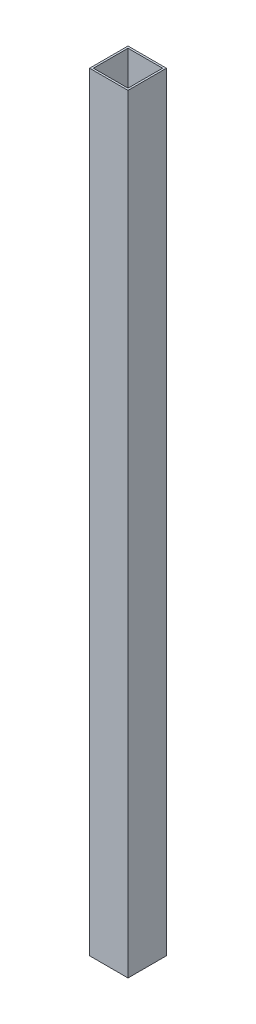
ISO-10303-21;
HEADER;
FILE_DESCRIPTION(('STEP AP214'),'2;1');
FILE_NAME('part.step','',(''),(''),'','','');
FILE_SCHEMA(('AUTOMOTIVE_DESIGN { 1 0 10303 214 1 1 1 1 }'));
ENDSEC;
DATA;
#1=APPLICATION_CONTEXT('core data for automotive mechanical design processes');
#2=APPLICATION_PROTOCOL_DEFINITION('international standard','automotive_design',2000,#1);
#3=PRODUCT_CONTEXT('',#1,'mechanical');
#4=PRODUCT('Part','Part','',(#3));
#5=PRODUCT_RELATED_PRODUCT_CATEGORY('part','',(#4));
#6=PRODUCT_DEFINITION_FORMATION('','',#4);
#7=PRODUCT_DEFINITION_CONTEXT('part definition',#1,'design');
#8=PRODUCT_DEFINITION('design','',#6,#7);
#9=PRODUCT_DEFINITION_SHAPE('','',#8);
#10=(LENGTH_UNIT() NAMED_UNIT(*) SI_UNIT(.MILLI.,.METRE.));
#11=(NAMED_UNIT(*) PLANE_ANGLE_UNIT() SI_UNIT($,.RADIAN.));
#12=(NAMED_UNIT(*) SI_UNIT($,.STERADIAN.) SOLID_ANGLE_UNIT());
#13=UNCERTAINTY_MEASURE_WITH_UNIT(LENGTH_MEASURE(1.E-05),#10,'distance_accuracy_value','');
#14=(GEOMETRIC_REPRESENTATION_CONTEXT(3) GLOBAL_UNCERTAINTY_ASSIGNED_CONTEXT((#13)) GLOBAL_UNIT_ASSIGNED_CONTEXT((#10,
#11,#12)) REPRESENTATION_CONTEXT('',''));
#15=CARTESIAN_POINT('',(0.,0.,0.));
#16=DIRECTION('',(0.,0.,1.));
#17=DIRECTION('',(1.,0.,0.));
#18=AXIS2_PLACEMENT_3D('',#15,#16,#17);
#19=CARTESIAN_POINT('',(0.,508.,0.));
#20=DIRECTION('',(0.,-1.,0.));
#21=DIRECTION('',(0.,0.,-1.));
#22=AXIS2_PLACEMENT_3D('',#19,#20,#21);
#23=PLANE('',#22);
#24=DIRECTION('',(1.,0.,0.));
#25=VECTOR('',#24,1.);
#26=CARTESIAN_POINT('',(25.4,508.,0.));
#27=LINE('',#26,#25);
#28=CARTESIAN_POINT('',(0.,508.,0.));
#29=VERTEX_POINT('',#28);
#30=CARTESIAN_POINT('',(25.4,508.,0.));
#31=VERTEX_POINT('',#30);
#32=EDGE_CURVE('E134',#29,#31,#27,.T.);
#33=ORIENTED_EDGE('',*,*,#32,.T.);
#34=DIRECTION('',(0.,0.,-1.));
#35=VECTOR('',#34,1.);
#36=CARTESIAN_POINT('',(25.4,508.,-25.4));
#37=LINE('',#36,#35);
#38=CARTESIAN_POINT('',(25.4,508.,-25.4));
#39=VERTEX_POINT('',#38);
#40=EDGE_CURVE('E137',#31,#39,#37,.T.);
#41=ORIENTED_EDGE('',*,*,#40,.T.);
#42=DIRECTION('',(-1.,0.,0.));
#43=VECTOR('',#42,1.);
#44=CARTESIAN_POINT('',(0.,508.,-25.4));
#45=LINE('',#44,#43);
#46=CARTESIAN_POINT('',(0.,508.,-25.4));
#47=VERTEX_POINT('',#46);
#48=EDGE_CURVE('E140',#39,#47,#45,.T.);
#49=ORIENTED_EDGE('',*,*,#48,.T.);
#50=DIRECTION('',(0.,0.,1.));
#51=VECTOR('',#50,1.);
#52=CARTESIAN_POINT('',(0.,508.,0.));
#53=LINE('',#52,#51);
#54=EDGE_CURVE('E142',#47,#29,#53,.T.);
#55=ORIENTED_EDGE('',*,*,#54,.T.);
#56=EDGE_LOOP('',(#33,#41,#49,#55));
#57=FACE_BOUND('',#56,.T.);
#58=DIRECTION('',(1.,0.,0.));
#59=VECTOR('',#58,1.);
#60=CARTESIAN_POINT('',(1.27,508.,-1.27));
#61=LINE('',#60,#59);
#62=CARTESIAN_POINT('',(1.27,508.,-1.27));
#63=VERTEX_POINT('',#62);
#64=CARTESIAN_POINT('',(24.13,508.,-1.27));
#65=VERTEX_POINT('',#64);
#66=EDGE_CURVE('E101',#63,#65,#61,.T.);
#67=ORIENTED_EDGE('',*,*,#66,.F.);
#68=DIRECTION('',(0.,0.,1.));
#69=VECTOR('',#68,1.);
#70=CARTESIAN_POINT('',(1.27,508.,-12.3614591557052));
#71=LINE('',#70,#69);
#72=CARTESIAN_POINT('',(1.27,508.,-24.13));
#73=VERTEX_POINT('',#72);
#74=EDGE_CURVE('E96',#73,#63,#71,.T.);
#75=ORIENTED_EDGE('',*,*,#74,.F.);
#76=DIRECTION('',(-1.,0.,0.));
#77=VECTOR('',#76,1.);
#78=CARTESIAN_POINT('',(12.7,508.,-24.13));
#79=LINE('',#78,#77);
#80=CARTESIAN_POINT('',(24.13,508.,-24.13));
#81=VERTEX_POINT('',#80);
#82=EDGE_CURVE('E117',#81,#73,#79,.T.);
#83=ORIENTED_EDGE('',*,*,#82,.F.);
#84=DIRECTION('',(0.,0.,-1.));
#85=VECTOR('',#84,1.);
#86=CARTESIAN_POINT('',(24.13,508.,-1.27));
#87=LINE('',#86,#85);
#88=EDGE_CURVE('E115',#65,#81,#87,.T.);
#89=ORIENTED_EDGE('',*,*,#88,.F.);
#90=EDGE_LOOP('',(#67,#75,#83,#89));
#91=FACE_BOUND('',#90,.T.);
#92=ADVANCED_FACE('F34',(#57,#91),#23,.F.);
#93=CARTESIAN_POINT('',(0.,0.,0.));
#94=DIRECTION('',(0.,-1.,0.));
#95=DIRECTION('',(0.,0.,-1.));
#96=AXIS2_PLACEMENT_3D('',#93,#94,#95);
#97=PLANE('',#96);
#98=DIRECTION('',(1.,0.,0.));
#99=VECTOR('',#98,1.);
#100=CARTESIAN_POINT('',(25.4,0.,0.));
#101=LINE('',#100,#99);
#102=CARTESIAN_POINT('',(0.,0.,0.));
#103=VERTEX_POINT('',#102);
#104=CARTESIAN_POINT('',(25.4,0.,0.));
#105=VERTEX_POINT('',#104);
#106=EDGE_CURVE('E111',#103,#105,#101,.T.);
#107=ORIENTED_EDGE('',*,*,#106,.F.);
#108=DIRECTION('',(0.,0.,1.));
#109=VECTOR('',#108,1.);
#110=CARTESIAN_POINT('',(0.,0.,0.));
#111=LINE('',#110,#109);
#112=CARTESIAN_POINT('',(0.,0.,-25.4));
#113=VERTEX_POINT('',#112);
#114=EDGE_CURVE('E138',#113,#103,#111,.T.);
#115=ORIENTED_EDGE('',*,*,#114,.F.);
#116=DIRECTION('',(-1.,0.,0.));
#117=VECTOR('',#116,1.);
#118=CARTESIAN_POINT('',(0.,0.,-25.4));
#119=LINE('',#118,#117);
#120=CARTESIAN_POINT('',(25.4,0.,-25.4));
#121=VERTEX_POINT('',#120);
#122=EDGE_CURVE('E149',#121,#113,#119,.T.);
#123=ORIENTED_EDGE('',*,*,#122,.F.);
#124=DIRECTION('',(0.,0.,-1.));
#125=VECTOR('',#124,1.);
#126=CARTESIAN_POINT('',(25.4,0.,-25.4));
#127=LINE('',#126,#125);
#128=EDGE_CURVE('E147',#105,#121,#127,.T.);
#129=ORIENTED_EDGE('',*,*,#128,.F.);
#130=EDGE_LOOP('',(#107,#115,#123,#129));
#131=FACE_BOUND('',#130,.T.);
#132=DIRECTION('',(0.,0.,1.));
#133=VECTOR('',#132,1.);
#134=CARTESIAN_POINT('',(1.27,0.,-12.3614591557052));
#135=LINE('',#134,#133);
#136=CARTESIAN_POINT('',(1.27,0.,-24.13));
#137=VERTEX_POINT('',#136);
#138=CARTESIAN_POINT('',(1.27,0.,-1.27));
#139=VERTEX_POINT('',#138);
#140=EDGE_CURVE('E102',#137,#139,#135,.T.);
#141=ORIENTED_EDGE('',*,*,#140,.T.);
#142=DIRECTION('',(1.,0.,0.));
#143=VECTOR('',#142,1.);
#144=CARTESIAN_POINT('',(24.13,0.,-1.27));
#145=LINE('',#144,#143);
#146=CARTESIAN_POINT('',(24.13,0.,-1.27));
#147=VERTEX_POINT('',#146);
#148=EDGE_CURVE('E109',#139,#147,#145,.T.);
#149=ORIENTED_EDGE('',*,*,#148,.T.);
#150=DIRECTION('',(0.,0.,-1.));
#151=VECTOR('',#150,1.);
#152=CARTESIAN_POINT('',(24.13,0.,-24.13));
#153=LINE('',#152,#151);
#154=CARTESIAN_POINT('',(24.13,0.,-24.13));
#155=VERTEX_POINT('',#154);
#156=EDGE_CURVE('E122',#147,#155,#153,.T.);
#157=ORIENTED_EDGE('',*,*,#156,.T.);
#158=DIRECTION('',(-1.,0.,0.));
#159=VECTOR('',#158,1.);
#160=CARTESIAN_POINT('',(1.27,0.,-24.13));
#161=LINE('',#160,#159);
#162=EDGE_CURVE('E125',#155,#137,#161,.T.);
#163=ORIENTED_EDGE('',*,*,#162,.T.);
#164=EDGE_LOOP('',(#141,#149,#157,#163));
#165=FACE_BOUND('',#164,.T.);
#166=ADVANCED_FACE('F167',(#131,#165),#97,.T.);
#167=CARTESIAN_POINT('',(25.4,508.,0.));
#168=DIRECTION('',(0.,0.,-1.));
#169=DIRECTION('',(-1.,0.,0.));
#170=AXIS2_PLACEMENT_3D('',#167,#168,#169);
#171=PLANE('',#170);
#172=ORIENTED_EDGE('',*,*,#106,.T.);
#173=DIRECTION('',(0.,-1.,0.));
#174=VECTOR('',#173,1.);
#175=CARTESIAN_POINT('',(25.4,508.,0.));
#176=LINE('',#175,#174);
#177=EDGE_CURVE('E11',#31,#105,#176,.T.);
#178=ORIENTED_EDGE('',*,*,#177,.F.);
#179=ORIENTED_EDGE('',*,*,#32,.F.);
#180=DIRECTION('',(0.,-1.,0.));
#181=VECTOR('',#180,1.);
#182=CARTESIAN_POINT('',(0.,508.,0.));
#183=LINE('',#182,#181);
#184=EDGE_CURVE('E144',#29,#103,#183,.T.);
#185=ORIENTED_EDGE('',*,*,#184,.T.);
#186=EDGE_LOOP('',(#172,#178,#179,#185));
#187=FACE_BOUND('',#186,.T.);
#188=ADVANCED_FACE('F36',(#187),#171,.F.);
#189=CARTESIAN_POINT('',(25.4,508.,-25.4));
#190=DIRECTION('',(-1.,0.,0.));
#191=DIRECTION('',(0.,0.,1.));
#192=AXIS2_PLACEMENT_3D('',#189,#190,#191);
#193=PLANE('',#192);
#194=ORIENTED_EDGE('',*,*,#128,.T.);
#195=DIRECTION('',(0.,-1.,0.));
#196=VECTOR('',#195,1.);
#197=CARTESIAN_POINT('',(25.4,508.,-25.4));
#198=LINE('',#197,#196);
#199=EDGE_CURVE('E42',#39,#121,#198,.T.);
#200=ORIENTED_EDGE('',*,*,#199,.F.);
#201=ORIENTED_EDGE('',*,*,#40,.F.);
#202=ORIENTED_EDGE('',*,*,#177,.T.);
#203=EDGE_LOOP('',(#194,#200,#201,#202));
#204=FACE_BOUND('',#203,.T.);
#205=ADVANCED_FACE('F177',(#204),#193,.F.);
#206=CARTESIAN_POINT('',(0.,508.,-25.4));
#207=DIRECTION('',(0.,0.,1.));
#208=DIRECTION('',(1.,0.,0.));
#209=AXIS2_PLACEMENT_3D('',#206,#207,#208);
#210=PLANE('',#209);
#211=ORIENTED_EDGE('',*,*,#122,.T.);
#212=DIRECTION('',(0.,-1.,0.));
#213=VECTOR('',#212,1.);
#214=CARTESIAN_POINT('',(0.,508.,-25.4));
#215=LINE('',#214,#213);
#216=EDGE_CURVE('E154',#47,#113,#215,.T.);
#217=ORIENTED_EDGE('',*,*,#216,.F.);
#218=ORIENTED_EDGE('',*,*,#48,.F.);
#219=ORIENTED_EDGE('',*,*,#199,.T.);
#220=EDGE_LOOP('',(#211,#217,#218,#219));
#221=FACE_BOUND('',#220,.T.);
#222=ADVANCED_FACE('F161',(#221),#210,.F.);
#223=CARTESIAN_POINT('',(0.,508.,0.));
#224=DIRECTION('',(1.,0.,0.));
#225=DIRECTION('',(0.,0.,-1.));
#226=AXIS2_PLACEMENT_3D('',#223,#224,#225);
#227=PLANE('',#226);
#228=ORIENTED_EDGE('',*,*,#114,.T.);
#229=ORIENTED_EDGE('',*,*,#184,.F.);
#230=ORIENTED_EDGE('',*,*,#54,.F.);
#231=ORIENTED_EDGE('',*,*,#216,.T.);
#232=EDGE_LOOP('',(#228,#229,#230,#231));
#233=FACE_BOUND('',#232,.T.);
#234=ADVANCED_FACE('F171',(#233),#227,.F.);
#235=CARTESIAN_POINT('',(24.13,508.,-1.27));
#236=DIRECTION('',(0.,0.,-1.));
#237=DIRECTION('',(-1.,0.,0.));
#238=AXIS2_PLACEMENT_3D('',#235,#236,#237);
#239=PLANE('',#238);
#240=ORIENTED_EDGE('',*,*,#148,.F.);
#241=DIRECTION('',(0.,-1.,0.));
#242=VECTOR('',#241,1.);
#243=CARTESIAN_POINT('',(1.27,508.,-1.27));
#244=LINE('',#243,#242);
#245=EDGE_CURVE('E54',#63,#139,#244,.T.);
#246=ORIENTED_EDGE('',*,*,#245,.F.);
#247=ORIENTED_EDGE('',*,*,#66,.T.);
#248=DIRECTION('',(0.,-1.,0.));
#249=VECTOR('',#248,1.);
#250=CARTESIAN_POINT('',(24.13,508.,-1.27));
#251=LINE('',#250,#249);
#252=EDGE_CURVE('E112',#65,#147,#251,.T.);
#253=ORIENTED_EDGE('',*,*,#252,.T.);
#254=EDGE_LOOP('',(#240,#246,#247,#253));
#255=FACE_BOUND('',#254,.T.);
#256=ADVANCED_FACE('F105',(#255),#239,.T.);
#257=CARTESIAN_POINT('',(24.13,508.,-24.13));
#258=DIRECTION('',(-1.,0.,0.));
#259=DIRECTION('',(0.,0.,1.));
#260=AXIS2_PLACEMENT_3D('',#257,#258,#259);
#261=PLANE('',#260);
#262=ORIENTED_EDGE('',*,*,#156,.F.);
#263=ORIENTED_EDGE('',*,*,#252,.F.);
#264=ORIENTED_EDGE('',*,*,#88,.T.);
#265=DIRECTION('',(0.,-1.,0.));
#266=VECTOR('',#265,1.);
#267=CARTESIAN_POINT('',(24.13,508.,-24.13));
#268=LINE('',#267,#266);
#269=EDGE_CURVE('E130',#81,#155,#268,.T.);
#270=ORIENTED_EDGE('',*,*,#269,.T.);
#271=EDGE_LOOP('',(#262,#263,#264,#270));
#272=FACE_BOUND('',#271,.T.);
#273=ADVANCED_FACE('F197',(#272),#261,.T.);
#274=CARTESIAN_POINT('',(1.27,508.,-24.13));
#275=DIRECTION('',(0.,0.,1.));
#276=DIRECTION('',(1.,0.,0.));
#277=AXIS2_PLACEMENT_3D('',#274,#275,#276);
#278=PLANE('',#277);
#279=ORIENTED_EDGE('',*,*,#162,.F.);
#280=ORIENTED_EDGE('',*,*,#269,.F.);
#281=ORIENTED_EDGE('',*,*,#82,.T.);
#282=DIRECTION('',(0.,-1.,0.));
#283=VECTOR('',#282,1.);
#284=CARTESIAN_POINT('',(1.27,508.,-24.13));
#285=LINE('',#284,#283);
#286=EDGE_CURVE('E49',#73,#137,#285,.T.);
#287=ORIENTED_EDGE('',*,*,#286,.T.);
#288=EDGE_LOOP('',(#279,#280,#281,#287));
#289=FACE_BOUND('',#288,.T.);
#290=ADVANCED_FACE('F201',(#289),#278,.T.);
#291=CARTESIAN_POINT('',(1.27,508.,-12.3614591557052));
#292=DIRECTION('',(1.,0.,0.));
#293=DIRECTION('',(0.,0.,-1.));
#294=AXIS2_PLACEMENT_3D('',#291,#292,#293);
#295=PLANE('',#294);
#296=ORIENTED_EDGE('',*,*,#140,.F.);
#297=ORIENTED_EDGE('',*,*,#286,.F.);
#298=ORIENTED_EDGE('',*,*,#74,.T.);
#299=ORIENTED_EDGE('',*,*,#245,.T.);
#300=EDGE_LOOP('',(#296,#297,#298,#299));
#301=FACE_BOUND('',#300,.T.);
#302=ADVANCED_FACE('F97',(#301),#295,.T.);
#303=CLOSED_SHELL('',(#92,#166,#188,#205,#222,#234,#256,#273,#290,#302));
#304=MANIFOLD_SOLID_BREP('B2',#303);
#305=ADVANCED_BREP_SHAPE_REPRESENTATION('',(#18,#304),#14);
#306=SHAPE_DEFINITION_REPRESENTATION(#9,#305);
ENDSEC;
END-ISO-10303-21;
